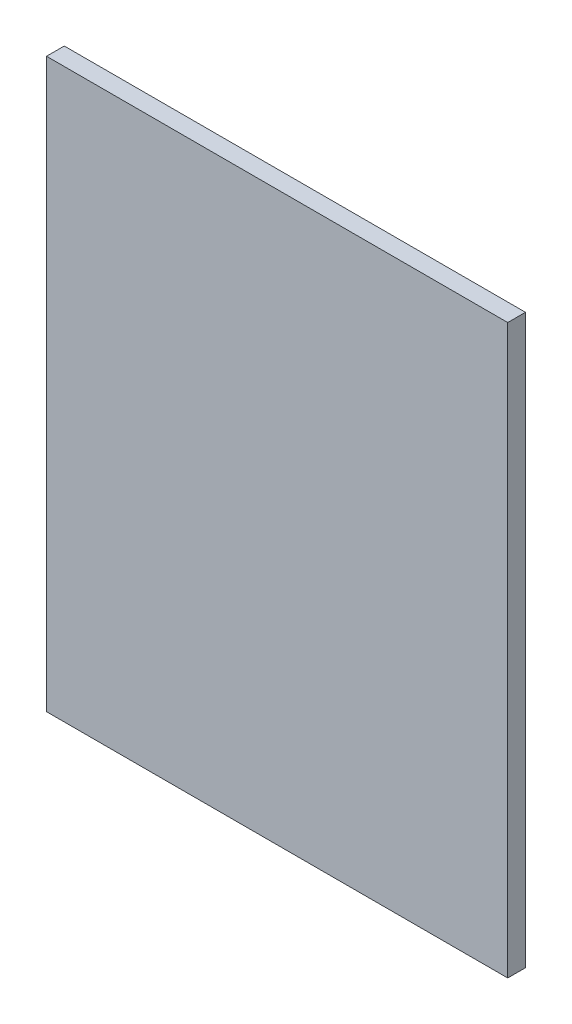
ISO-10303-21;
HEADER;
FILE_DESCRIPTION(('STEP AP214'),'2;1');
FILE_NAME('part.step','',(''),(''),'','','');
FILE_SCHEMA(('AUTOMOTIVE_DESIGN { 1 0 10303 214 1 1 1 1 }'));
ENDSEC;
DATA;
#1=APPLICATION_CONTEXT('core data for automotive mechanical design processes');
#2=APPLICATION_PROTOCOL_DEFINITION('international standard','automotive_design',2000,#1);
#3=PRODUCT_CONTEXT('',#1,'mechanical');
#4=PRODUCT('Part','Part','',(#3));
#5=PRODUCT_RELATED_PRODUCT_CATEGORY('part','',(#4));
#6=PRODUCT_DEFINITION_FORMATION('','',#4);
#7=PRODUCT_DEFINITION_CONTEXT('part definition',#1,'design');
#8=PRODUCT_DEFINITION('design','',#6,#7);
#9=PRODUCT_DEFINITION_SHAPE('','',#8);
#10=(LENGTH_UNIT() NAMED_UNIT(*) SI_UNIT(.MILLI.,.METRE.));
#11=(NAMED_UNIT(*) PLANE_ANGLE_UNIT() SI_UNIT($,.RADIAN.));
#12=(NAMED_UNIT(*) SI_UNIT($,.STERADIAN.) SOLID_ANGLE_UNIT());
#13=UNCERTAINTY_MEASURE_WITH_UNIT(LENGTH_MEASURE(1.E-05),#10,'distance_accuracy_value','');
#14=(GEOMETRIC_REPRESENTATION_CONTEXT(3) GLOBAL_UNCERTAINTY_ASSIGNED_CONTEXT((#13)) GLOBAL_UNIT_ASSIGNED_CONTEXT((#10,
#11,#12)) REPRESENTATION_CONTEXT('',''));
#15=CARTESIAN_POINT('',(0.,0.,0.));
#16=DIRECTION('',(0.,0.,1.));
#17=DIRECTION('',(1.,0.,0.));
#18=AXIS2_PLACEMENT_3D('',#15,#16,#17);
#19=CARTESIAN_POINT('',(-130.,0.,5.));
#20=DIRECTION('',(0.,1.,0.));
#21=DIRECTION('',(0.,0.,1.));
#22=AXIS2_PLACEMENT_3D('',#19,#20,#21);
#23=PLANE('',#22);
#24=DIRECTION('',(1.,0.,0.));
#25=VECTOR('',#24,1.);
#26=CARTESIAN_POINT('',(-130.,0.,0.));
#27=LINE('',#26,#25);
#28=CARTESIAN_POINT('',(-130.,0.,0.));
#29=VERTEX_POINT('',#28);
#30=CARTESIAN_POINT('',(0.,0.,0.));
#31=VERTEX_POINT('',#30);
#32=EDGE_CURVE('E96',#29,#31,#27,.T.);
#33=ORIENTED_EDGE('',*,*,#32,.T.);
#34=DIRECTION('',(0.,0.,-1.));
#35=VECTOR('',#34,1.);
#36=CARTESIAN_POINT('',(0.,0.,5.));
#37=LINE('',#36,#35);
#38=CARTESIAN_POINT('',(0.,0.,5.));
#39=VERTEX_POINT('',#38);
#40=EDGE_CURVE('E11',#39,#31,#37,.T.);
#41=ORIENTED_EDGE('',*,*,#40,.F.);
#42=DIRECTION('',(1.,0.,0.));
#43=VECTOR('',#42,1.);
#44=CARTESIAN_POINT('',(-130.,0.,5.));
#45=LINE('',#44,#43);
#46=CARTESIAN_POINT('',(-130.,0.,5.));
#47=VERTEX_POINT('',#46);
#48=EDGE_CURVE('E84',#47,#39,#45,.T.);
#49=ORIENTED_EDGE('',*,*,#48,.F.);
#50=DIRECTION('',(0.,0.,-1.));
#51=VECTOR('',#50,1.);
#52=CARTESIAN_POINT('',(-130.,0.,5.));
#53=LINE('',#52,#51);
#54=EDGE_CURVE('E92',#47,#29,#53,.T.);
#55=ORIENTED_EDGE('',*,*,#54,.T.);
#56=EDGE_LOOP('',(#33,#41,#49,#55));
#57=FACE_BOUND('',#56,.T.);
#58=ADVANCED_FACE('F33',(#57),#23,.F.);
#59=CARTESIAN_POINT('',(0.,0.,5.));
#60=DIRECTION('',(-1.,0.,0.));
#61=DIRECTION('',(0.,0.,1.));
#62=AXIS2_PLACEMENT_3D('',#59,#60,#61);
#63=PLANE('',#62);
#64=DIRECTION('',(0.,1.,0.));
#65=VECTOR('',#64,1.);
#66=CARTESIAN_POINT('',(0.,0.,0.));
#67=LINE('',#66,#65);
#68=CARTESIAN_POINT('',(0.,160.,0.));
#69=VERTEX_POINT('',#68);
#70=EDGE_CURVE('E88',#31,#69,#67,.T.);
#71=ORIENTED_EDGE('',*,*,#70,.T.);
#72=DIRECTION('',(0.,0.,-1.));
#73=VECTOR('',#72,1.);
#74=CARTESIAN_POINT('',(0.,160.,5.));
#75=LINE('',#74,#73);
#76=CARTESIAN_POINT('',(0.,160.,5.));
#77=VERTEX_POINT('',#76);
#78=EDGE_CURVE('E41',#77,#69,#75,.T.);
#79=ORIENTED_EDGE('',*,*,#78,.F.);
#80=DIRECTION('',(0.,1.,0.));
#81=VECTOR('',#80,1.);
#82=CARTESIAN_POINT('',(0.,0.,5.));
#83=LINE('',#82,#81);
#84=EDGE_CURVE('E79',#39,#77,#83,.T.);
#85=ORIENTED_EDGE('',*,*,#84,.F.);
#86=ORIENTED_EDGE('',*,*,#40,.T.);
#87=EDGE_LOOP('',(#71,#79,#85,#86));
#88=FACE_BOUND('',#87,.T.);
#89=ADVANCED_FACE('F87',(#88),#63,.F.);
#90=CARTESIAN_POINT('',(0.,160.,5.));
#91=DIRECTION('',(0.,-1.,0.));
#92=DIRECTION('',(1.,0.,0.));
#93=AXIS2_PLACEMENT_3D('',#90,#91,#92);
#94=PLANE('',#93);
#95=DIRECTION('',(-1.,0.,0.));
#96=VECTOR('',#95,1.);
#97=CARTESIAN_POINT('',(0.,160.,0.));
#98=LINE('',#97,#96);
#99=CARTESIAN_POINT('',(-130.,160.,0.));
#100=VERTEX_POINT('',#99);
#101=EDGE_CURVE('E66',#69,#100,#98,.T.);
#102=ORIENTED_EDGE('',*,*,#101,.T.);
#103=DIRECTION('',(0.,0.,-1.));
#104=VECTOR('',#103,1.);
#105=CARTESIAN_POINT('',(-130.,160.,5.));
#106=LINE('',#105,#104);
#107=CARTESIAN_POINT('',(-130.,160.,5.));
#108=VERTEX_POINT('',#107);
#109=EDGE_CURVE('E89',#108,#100,#106,.T.);
#110=ORIENTED_EDGE('',*,*,#109,.F.);
#111=DIRECTION('',(-1.,0.,0.));
#112=VECTOR('',#111,1.);
#113=CARTESIAN_POINT('',(0.,160.,5.));
#114=LINE('',#113,#112);
#115=EDGE_CURVE('E82',#77,#108,#114,.T.);
#116=ORIENTED_EDGE('',*,*,#115,.F.);
#117=ORIENTED_EDGE('',*,*,#78,.T.);
#118=EDGE_LOOP('',(#102,#110,#116,#117));
#119=FACE_BOUND('',#118,.T.);
#120=ADVANCED_FACE('F90',(#119),#94,.F.);
#121=CARTESIAN_POINT('',(-130.,160.,5.));
#122=DIRECTION('',(1.,0.,0.));
#123=DIRECTION('',(0.,1.,0.));
#124=AXIS2_PLACEMENT_3D('',#121,#122,#123);
#125=PLANE('',#124);
#126=DIRECTION('',(0.,-1.,0.));
#127=VECTOR('',#126,1.);
#128=CARTESIAN_POINT('',(-130.,160.,0.));
#129=LINE('',#128,#127);
#130=EDGE_CURVE('E72',#100,#29,#129,.T.);
#131=ORIENTED_EDGE('',*,*,#130,.T.);
#132=ORIENTED_EDGE('',*,*,#54,.F.);
#133=DIRECTION('',(0.,-1.,0.));
#134=VECTOR('',#133,1.);
#135=CARTESIAN_POINT('',(-130.,160.,5.));
#136=LINE('',#135,#134);
#137=EDGE_CURVE('E49',#108,#47,#136,.T.);
#138=ORIENTED_EDGE('',*,*,#137,.F.);
#139=ORIENTED_EDGE('',*,*,#109,.T.);
#140=EDGE_LOOP('',(#131,#132,#138,#139));
#141=FACE_BOUND('',#140,.T.);
#142=ADVANCED_FACE('F103',(#141),#125,.F.);
#143=CARTESIAN_POINT('',(0.,0.,5.));
#144=DIRECTION('',(0.,0.,1.));
#145=DIRECTION('',(1.,0.,0.));
#146=AXIS2_PLACEMENT_3D('',#143,#144,#145);
#147=PLANE('',#146);
#148=ORIENTED_EDGE('',*,*,#48,.T.);
#149=ORIENTED_EDGE('',*,*,#84,.T.);
#150=ORIENTED_EDGE('',*,*,#115,.T.);
#151=ORIENTED_EDGE('',*,*,#137,.T.);
#152=EDGE_LOOP('',(#148,#149,#150,#151));
#153=FACE_BOUND('',#152,.T.);
#154=ADVANCED_FACE('F80',(#153),#147,.T.);
#155=CARTESIAN_POINT('',(0.,0.,0.));
#156=DIRECTION('',(0.,0.,1.));
#157=DIRECTION('',(1.,0.,0.));
#158=AXIS2_PLACEMENT_3D('',#155,#156,#157);
#159=PLANE('',#158);
#160=ORIENTED_EDGE('',*,*,#32,.F.);
#161=ORIENTED_EDGE('',*,*,#130,.F.);
#162=ORIENTED_EDGE('',*,*,#101,.F.);
#163=ORIENTED_EDGE('',*,*,#70,.F.);
#164=EDGE_LOOP('',(#160,#161,#162,#163));
#165=FACE_BOUND('',#164,.T.);
#166=ADVANCED_FACE('F106',(#165),#159,.F.);
#167=CLOSED_SHELL('',(#58,#89,#120,#142,#154,#166));
#168=MANIFOLD_SOLID_BREP('B2',#167);
#169=ADVANCED_BREP_SHAPE_REPRESENTATION('',(#18,#168),#14);
#170=SHAPE_DEFINITION_REPRESENTATION(#9,#169);
ENDSEC;
END-ISO-10303-21;
